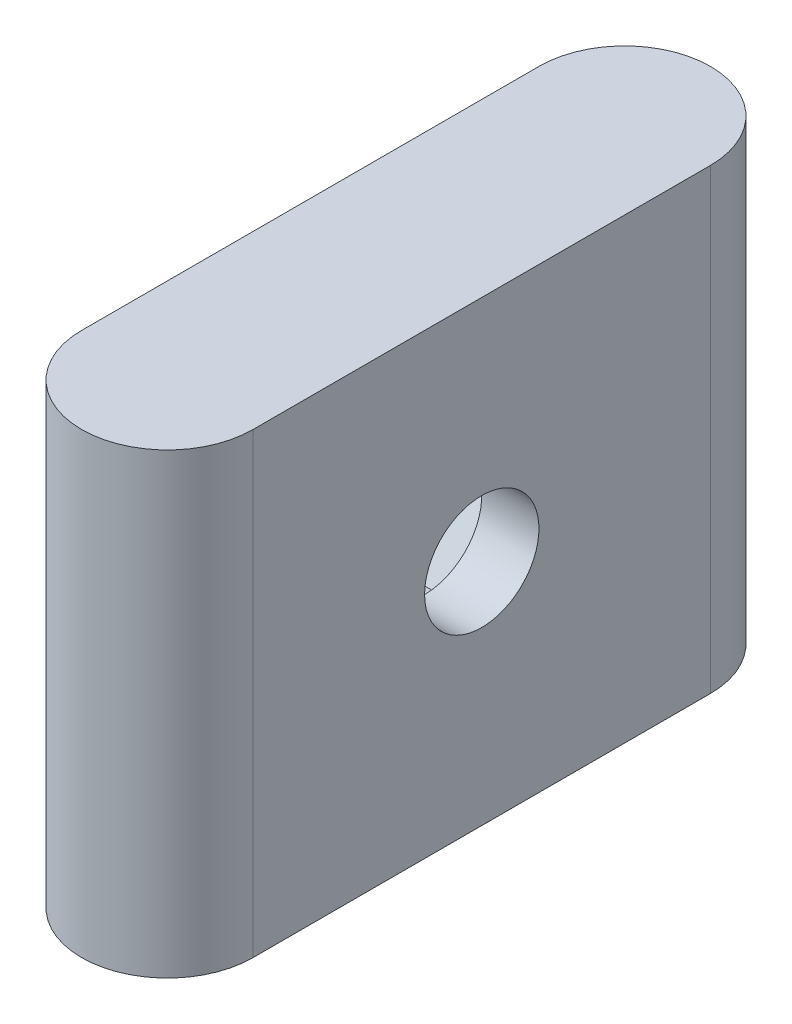
ISO-10303-21;
HEADER;
FILE_DESCRIPTION(('STEP AP214'),'2;1');
FILE_NAME('part.step','',(''),(''),'','','');
FILE_SCHEMA(('AUTOMOTIVE_DESIGN { 1 0 10303 214 1 1 1 1 }'));
ENDSEC;
DATA;
#1=APPLICATION_CONTEXT('core data for automotive mechanical design processes');
#2=APPLICATION_PROTOCOL_DEFINITION('international standard','automotive_design',2000,#1);
#3=PRODUCT_CONTEXT('',#1,'mechanical');
#4=PRODUCT('Part','Part','',(#3));
#5=PRODUCT_RELATED_PRODUCT_CATEGORY('part','',(#4));
#6=PRODUCT_DEFINITION_FORMATION('','',#4);
#7=PRODUCT_DEFINITION_CONTEXT('part definition',#1,'design');
#8=PRODUCT_DEFINITION('design','',#6,#7);
#9=PRODUCT_DEFINITION_SHAPE('','',#8);
#10=(LENGTH_UNIT() NAMED_UNIT(*) SI_UNIT(.MILLI.,.METRE.));
#11=(NAMED_UNIT(*) PLANE_ANGLE_UNIT() SI_UNIT($,.RADIAN.));
#12=(NAMED_UNIT(*) SI_UNIT($,.STERADIAN.) SOLID_ANGLE_UNIT());
#13=UNCERTAINTY_MEASURE_WITH_UNIT(LENGTH_MEASURE(1.E-05),#10,'distance_accuracy_value','');
#14=(GEOMETRIC_REPRESENTATION_CONTEXT(3) GLOBAL_UNCERTAINTY_ASSIGNED_CONTEXT((#13)) GLOBAL_UNIT_ASSIGNED_CONTEXT((#10,
#11,#12)) REPRESENTATION_CONTEXT('',''));
#15=CARTESIAN_POINT('',(0.,0.,0.));
#16=DIRECTION('',(0.,0.,1.));
#17=DIRECTION('',(1.,0.,0.));
#18=AXIS2_PLACEMENT_3D('',#15,#16,#17);
#19=CARTESIAN_POINT('',(16.25,10.,-1.54270387980563));
#20=DIRECTION('',(-1.,0.,0.));
#21=DIRECTION('',(0.,0.,1.));
#22=AXIS2_PLACEMENT_3D('',#19,#20,#21);
#23=CYLINDRICAL_SURFACE('',#22,2.5);
#24=CARTESIAN_POINT('',(3.75,10.,-1.54270387980563));
#25=DIRECTION('',(-1.,0.,0.));
#26=DIRECTION('',(0.,0.,1.));
#27=AXIS2_PLACEMENT_3D('',#24,#25,#26);
#28=CIRCLE('',#27,2.5);
#29=CARTESIAN_POINT('',(3.75,10.,0.957296120194369));
#30=VERTEX_POINT('',#29);
#31=EDGE_CURVE('E191',#30,#30,#28,.T.);
#32=ORIENTED_EDGE('',*,*,#31,.F.);
#33=EDGE_LOOP('',(#32));
#34=FACE_BOUND('',#33,.T.);
#35=CARTESIAN_POINT('',(1.25,10.,-1.54270387980563));
#36=DIRECTION('',(-1.,0.,0.));
#37=DIRECTION('',(0.,0.,1.));
#38=AXIS2_PLACEMENT_3D('',#35,#36,#37);
#39=CIRCLE('',#38,2.5);
#40=CARTESIAN_POINT('',(1.25,10.,0.957296120194369));
#41=VERTEX_POINT('',#40);
#42=EDGE_CURVE('E159',#41,#41,#39,.T.);
#43=ORIENTED_EDGE('',*,*,#42,.T.);
#44=EDGE_LOOP('',(#43));
#45=FACE_BOUND('',#44,.T.);
#46=ADVANCED_FACE('F41',(#34,#45),#23,.F.);
#47=CARTESIAN_POINT('',(0.,20.,8.45729612019437));
#48=DIRECTION('',(0.,-1.,0.));
#49=DIRECTION('',(0.,0.,-1.));
#50=AXIS2_PLACEMENT_3D('',#47,#48,#49);
#51=CYLINDRICAL_SURFACE('',#50,3.75);
#52=CARTESIAN_POINT('',(0.,0.,8.45729612019437));
#53=DIRECTION('',(0.,1.,0.));
#54=DIRECTION('',(0.,0.,1.));
#55=AXIS2_PLACEMENT_3D('',#52,#53,#54);
#56=CIRCLE('',#55,3.75);
#57=CARTESIAN_POINT('',(-3.75,0.,8.45729612019437));
#58=VERTEX_POINT('',#57);
#59=CARTESIAN_POINT('',(3.75,0.,8.45729612019437));
#60=VERTEX_POINT('',#59);
#61=EDGE_CURVE('E206',#58,#60,#56,.T.);
#62=ORIENTED_EDGE('',*,*,#61,.T.);
#63=DIRECTION('',(0.,-1.,0.));
#64=VECTOR('',#63,1.);
#65=CARTESIAN_POINT('',(3.75,20.,8.45729612019437));
#66=LINE('',#65,#64);
#67=CARTESIAN_POINT('',(3.75,20.,8.45729612019437));
#68=VERTEX_POINT('',#67);
#69=EDGE_CURVE('E11',#68,#60,#66,.T.);
#70=ORIENTED_EDGE('',*,*,#69,.F.);
#71=CARTESIAN_POINT('',(0.,20.,8.45729612019437));
#72=DIRECTION('',(0.,1.,0.));
#73=DIRECTION('',(0.,0.,1.));
#74=AXIS2_PLACEMENT_3D('',#71,#72,#73);
#75=CIRCLE('',#74,3.75);
#76=CARTESIAN_POINT('',(-3.75,20.,8.45729612019437));
#77=VERTEX_POINT('',#76);
#78=EDGE_CURVE('E207',#77,#68,#75,.T.);
#79=ORIENTED_EDGE('',*,*,#78,.F.);
#80=DIRECTION('',(0.,-1.,0.));
#81=VECTOR('',#80,1.);
#82=CARTESIAN_POINT('',(-3.75,20.,8.45729612019437));
#83=LINE('',#82,#81);
#84=EDGE_CURVE('E217',#77,#58,#83,.T.);
#85=ORIENTED_EDGE('',*,*,#84,.T.);
#86=EDGE_LOOP('',(#62,#70,#79,#85));
#87=FACE_BOUND('',#86,.T.);
#88=ADVANCED_FACE('F43',(#87),#51,.T.);
#89=CARTESIAN_POINT('',(3.75,20.,8.45729612019437));
#90=DIRECTION('',(-1.,0.,0.));
#91=DIRECTION('',(0.,0.,1.));
#92=AXIS2_PLACEMENT_3D('',#89,#90,#91);
#93=PLANE('',#92);
#94=ORIENTED_EDGE('',*,*,#31,.T.);
#95=EDGE_LOOP('',(#94));
#96=FACE_BOUND('',#95,.T.);
#97=DIRECTION('',(0.,0.,-1.));
#98=VECTOR('',#97,1.);
#99=CARTESIAN_POINT('',(3.75,0.,8.45729612019437));
#100=LINE('',#99,#98);
#101=CARTESIAN_POINT('',(3.75,0.,-11.5427038798056));
#102=VERTEX_POINT('',#101);
#103=EDGE_CURVE('E221',#60,#102,#100,.T.);
#104=ORIENTED_EDGE('',*,*,#103,.T.);
#105=DIRECTION('',(0.,-1.,0.));
#106=VECTOR('',#105,1.);
#107=CARTESIAN_POINT('',(3.75,20.,-11.5427038798056));
#108=LINE('',#107,#106);
#109=CARTESIAN_POINT('',(3.75,20.,-11.5427038798056));
#110=VERTEX_POINT('',#109);
#111=EDGE_CURVE('E50',#110,#102,#108,.T.);
#112=ORIENTED_EDGE('',*,*,#111,.F.);
#113=DIRECTION('',(0.,0.,-1.));
#114=VECTOR('',#113,1.);
#115=CARTESIAN_POINT('',(3.75,20.,8.45729612019437));
#116=LINE('',#115,#114);
#117=EDGE_CURVE('E94',#68,#110,#116,.T.);
#118=ORIENTED_EDGE('',*,*,#117,.F.);
#119=ORIENTED_EDGE('',*,*,#69,.T.);
#120=EDGE_LOOP('',(#104,#112,#118,#119));
#121=FACE_BOUND('',#120,.T.);
#122=ADVANCED_FACE('F256',(#96,#121),#93,.F.);
#123=CARTESIAN_POINT('',(0.,20.,-11.5427038798056));
#124=DIRECTION('',(0.,-1.,0.));
#125=DIRECTION('',(0.,0.,-1.));
#126=AXIS2_PLACEMENT_3D('',#123,#124,#125);
#127=CYLINDRICAL_SURFACE('',#126,3.75);
#128=CARTESIAN_POINT('',(0.,0.,-11.5427038798056));
#129=DIRECTION('',(0.,1.,0.));
#130=DIRECTION('',(0.,0.,1.));
#131=AXIS2_PLACEMENT_3D('',#128,#129,#130);
#132=CIRCLE('',#131,3.75);
#133=CARTESIAN_POINT('',(-3.75,0.,-11.5427038798056));
#134=VERTEX_POINT('',#133);
#135=EDGE_CURVE('E224',#102,#134,#132,.T.);
#136=ORIENTED_EDGE('',*,*,#135,.T.);
#137=DIRECTION('',(0.,-1.,0.));
#138=VECTOR('',#137,1.);
#139=CARTESIAN_POINT('',(-3.75,20.,-11.5427038798056));
#140=LINE('',#139,#138);
#141=CARTESIAN_POINT('',(-3.75,20.,-11.5427038798056));
#142=VERTEX_POINT('',#141);
#143=EDGE_CURVE('E231',#142,#134,#140,.T.);
#144=ORIENTED_EDGE('',*,*,#143,.F.);
#145=CARTESIAN_POINT('',(0.,20.,-11.5427038798056));
#146=DIRECTION('',(0.,1.,0.));
#147=DIRECTION('',(0.,0.,1.));
#148=AXIS2_PLACEMENT_3D('',#145,#146,#147);
#149=CIRCLE('',#148,3.75);
#150=EDGE_CURVE('E212',#110,#142,#149,.T.);
#151=ORIENTED_EDGE('',*,*,#150,.F.);
#152=ORIENTED_EDGE('',*,*,#111,.T.);
#153=EDGE_LOOP('',(#136,#144,#151,#152));
#154=FACE_BOUND('',#153,.T.);
#155=ADVANCED_FACE('F238',(#154),#127,.T.);
#156=CARTESIAN_POINT('',(-3.75,20.,8.45729612019437));
#157=DIRECTION('',(1.,0.,0.));
#158=DIRECTION('',(0.,0.,-1.));
#159=AXIS2_PLACEMENT_3D('',#156,#157,#158);
#160=PLANE('',#159);
#161=DIRECTION('',(0.,0.866025403784439,-0.5));
#162=VECTOR('',#161,1.);
#163=CARTESIAN_POINT('',(-3.75,10.,4.40209548739866));
#164=LINE('',#163,#162);
#165=CARTESIAN_POINT('',(-3.75,10.,4.40209548739866));
#166=VERTEX_POINT('',#165);
#167=CARTESIAN_POINT('',(-3.75,15.1483472724006,1.42969580379652));
#168=VERTEX_POINT('',#167);
#169=EDGE_CURVE('E174',#166,#168,#164,.T.);
#170=ORIENTED_EDGE('',*,*,#169,.F.);
#171=DIRECTION('',(0.,0.866025403784439,0.5));
#172=VECTOR('',#171,1.);
#173=CARTESIAN_POINT('',(-3.75,4.85165272759942,1.42969580379652));
#174=LINE('',#173,#172);
#175=CARTESIAN_POINT('',(-3.75,4.85165272759942,1.42969580379652));
#176=VERTEX_POINT('',#175);
#177=EDGE_CURVE('E57',#176,#166,#174,.T.);
#178=ORIENTED_EDGE('',*,*,#177,.F.);
#179=DIRECTION('',(0.,0.,1.));
#180=VECTOR('',#179,1.);
#181=CARTESIAN_POINT('',(-3.75,4.85165272759942,-4.51510356340778));
#182=LINE('',#181,#180);
#183=CARTESIAN_POINT('',(-3.75,4.85165272759942,-4.51510356340778));
#184=VERTEX_POINT('',#183);
#185=EDGE_CURVE('E152',#184,#176,#182,.T.);
#186=ORIENTED_EDGE('',*,*,#185,.F.);
#187=DIRECTION('',(0.,-0.866025403784438,0.5));
#188=VECTOR('',#187,1.);
#189=CARTESIAN_POINT('',(-3.75,9.99999999999999,-7.48750324700993));
#190=LINE('',#189,#188);
#191=CARTESIAN_POINT('',(-3.75,9.99999999999999,-7.48750324700993));
#192=VERTEX_POINT('',#191);
#193=EDGE_CURVE('E156',#192,#184,#190,.T.);
#194=ORIENTED_EDGE('',*,*,#193,.F.);
#195=DIRECTION('',(0.,-0.866025403784439,-0.5));
#196=VECTOR('',#195,1.);
#197=CARTESIAN_POINT('',(-3.75,15.1483472724006,-4.51510356340778));
#198=LINE('',#197,#196);
#199=CARTESIAN_POINT('',(-3.75,15.1483472724006,-4.51510356340778));
#200=VERTEX_POINT('',#199);
#201=EDGE_CURVE('E181',#200,#192,#198,.T.);
#202=ORIENTED_EDGE('',*,*,#201,.F.);
#203=DIRECTION('',(0.,0.,-1.));
#204=VECTOR('',#203,1.);
#205=CARTESIAN_POINT('',(-3.75,15.1483472724006,1.42969580379652));
#206=LINE('',#205,#204);
#207=EDGE_CURVE('E177',#168,#200,#206,.T.);
#208=ORIENTED_EDGE('',*,*,#207,.F.);
#209=EDGE_LOOP('',(#170,#178,#186,#194,#202,#208));
#210=FACE_BOUND('',#209,.T.);
#211=DIRECTION('',(0.,0.,1.));
#212=VECTOR('',#211,1.);
#213=CARTESIAN_POINT('',(-3.75,0.,8.45729612019437));
#214=LINE('',#213,#212);
#215=EDGE_CURVE('E87',#134,#58,#214,.T.);
#216=ORIENTED_EDGE('',*,*,#215,.T.);
#217=ORIENTED_EDGE('',*,*,#84,.F.);
#218=DIRECTION('',(0.,0.,1.));
#219=VECTOR('',#218,1.);
#220=CARTESIAN_POINT('',(-3.75,20.,8.45729612019437));
#221=LINE('',#220,#219);
#222=EDGE_CURVE('E66',#142,#77,#221,.T.);
#223=ORIENTED_EDGE('',*,*,#222,.F.);
#224=ORIENTED_EDGE('',*,*,#143,.T.);
#225=EDGE_LOOP('',(#216,#217,#223,#224));
#226=FACE_BOUND('',#225,.T.);
#227=ADVANCED_FACE('F246',(#210,#226),#160,.F.);
#228=CARTESIAN_POINT('',(0.,20.,8.45729612019437));
#229=DIRECTION('',(0.,1.,0.));
#230=DIRECTION('',(0.,0.,1.));
#231=AXIS2_PLACEMENT_3D('',#228,#229,#230);
#232=PLANE('',#231);
#233=ORIENTED_EDGE('',*,*,#78,.T.);
#234=ORIENTED_EDGE('',*,*,#117,.T.);
#235=ORIENTED_EDGE('',*,*,#150,.T.);
#236=ORIENTED_EDGE('',*,*,#222,.T.);
#237=EDGE_LOOP('',(#233,#234,#235,#236));
#238=FACE_BOUND('',#237,.T.);
#239=ADVANCED_FACE('F248',(#238),#232,.T.);
#240=CARTESIAN_POINT('',(0.,0.,8.45729612019437));
#241=DIRECTION('',(0.,1.,0.));
#242=DIRECTION('',(0.,0.,1.));
#243=AXIS2_PLACEMENT_3D('',#240,#241,#242);
#244=PLANE('',#243);
#245=ORIENTED_EDGE('',*,*,#61,.F.);
#246=ORIENTED_EDGE('',*,*,#215,.F.);
#247=ORIENTED_EDGE('',*,*,#135,.F.);
#248=ORIENTED_EDGE('',*,*,#103,.F.);
#249=EDGE_LOOP('',(#245,#246,#247,#248));
#250=FACE_BOUND('',#249,.T.);
#251=ADVANCED_FACE('F242',(#250),#244,.F.);
#252=CARTESIAN_POINT('',(1.25,4.85165272759942,1.42969580379652));
#253=DIRECTION('',(0.,-0.5,0.866025403784439));
#254=DIRECTION('',(0.,-0.866025403784439,-0.5));
#255=AXIS2_PLACEMENT_3D('',#252,#253,#254);
#256=PLANE('',#255);
#257=ORIENTED_EDGE('',*,*,#177,.T.);
#258=DIRECTION('',(-1.,0.,0.));
#259=VECTOR('',#258,1.);
#260=CARTESIAN_POINT('',(1.25,10.,4.40209548739866));
#261=LINE('',#260,#259);
#262=CARTESIAN_POINT('',(1.25,10.,4.40209548739866));
#263=VERTEX_POINT('',#262);
#264=EDGE_CURVE('E126',#263,#166,#261,.T.);
#265=ORIENTED_EDGE('',*,*,#264,.F.);
#266=DIRECTION('',(0.,0.866025403784439,0.5));
#267=VECTOR('',#266,1.);
#268=CARTESIAN_POINT('',(1.25,4.85165272759942,1.42969580379652));
#269=LINE('',#268,#267);
#270=CARTESIAN_POINT('',(1.25,4.85165272759942,1.42969580379652));
#271=VERTEX_POINT('',#270);
#272=EDGE_CURVE('E130',#271,#263,#269,.T.);
#273=ORIENTED_EDGE('',*,*,#272,.F.);
#274=DIRECTION('',(-1.,0.,0.));
#275=VECTOR('',#274,1.);
#276=CARTESIAN_POINT('',(1.25,4.85165272759942,1.42969580379652));
#277=LINE('',#276,#275);
#278=EDGE_CURVE('E188',#271,#176,#277,.T.);
#279=ORIENTED_EDGE('',*,*,#278,.T.);
#280=EDGE_LOOP('',(#257,#265,#273,#279));
#281=FACE_BOUND('',#280,.T.);
#282=ADVANCED_FACE('F128',(#281),#256,.F.);
#283=CARTESIAN_POINT('',(1.25,4.85165272759942,-4.51510356340778));
#284=DIRECTION('',(0.,-1.,0.));
#285=DIRECTION('',(0.,0.,-1.));
#286=AXIS2_PLACEMENT_3D('',#283,#284,#285);
#287=PLANE('',#286);
#288=ORIENTED_EDGE('',*,*,#185,.T.);
#289=ORIENTED_EDGE('',*,*,#278,.F.);
#290=DIRECTION('',(0.,0.,1.));
#291=VECTOR('',#290,1.);
#292=CARTESIAN_POINT('',(1.25,4.85165272759942,-4.51510356340778));
#293=LINE('',#292,#291);
#294=CARTESIAN_POINT('',(1.25,4.85165272759942,-4.51510356340778));
#295=VERTEX_POINT('',#294);
#296=EDGE_CURVE('E137',#295,#271,#293,.T.);
#297=ORIENTED_EDGE('',*,*,#296,.F.);
#298=DIRECTION('',(-1.,0.,0.));
#299=VECTOR('',#298,1.);
#300=CARTESIAN_POINT('',(1.25,4.85165272759942,-4.51510356340778));
#301=LINE('',#300,#299);
#302=EDGE_CURVE('E192',#295,#184,#301,.T.);
#303=ORIENTED_EDGE('',*,*,#302,.T.);
#304=EDGE_LOOP('',(#288,#289,#297,#303));
#305=FACE_BOUND('',#304,.T.);
#306=ADVANCED_FACE('F273',(#305),#287,.F.);
#307=CARTESIAN_POINT('',(1.25,9.99999999999999,-7.48750324700993));
#308=DIRECTION('',(0.,-0.5,-0.866025403784438));
#309=DIRECTION('',(0.,0.866025403784438,-0.5));
#310=AXIS2_PLACEMENT_3D('',#307,#308,#309);
#311=PLANE('',#310);
#312=ORIENTED_EDGE('',*,*,#193,.T.);
#313=ORIENTED_EDGE('',*,*,#302,.F.);
#314=DIRECTION('',(0.,-0.866025403784438,0.5));
#315=VECTOR('',#314,1.);
#316=CARTESIAN_POINT('',(1.25,9.99999999999999,-7.48750324700993));
#317=LINE('',#316,#315);
#318=CARTESIAN_POINT('',(1.25,9.99999999999999,-7.48750324700993));
#319=VERTEX_POINT('',#318);
#320=EDGE_CURVE('E167',#319,#295,#317,.T.);
#321=ORIENTED_EDGE('',*,*,#320,.F.);
#322=DIRECTION('',(-1.,0.,0.));
#323=VECTOR('',#322,1.);
#324=CARTESIAN_POINT('',(1.25,9.99999999999999,-7.48750324700993));
#325=LINE('',#324,#323);
#326=EDGE_CURVE('E195',#319,#192,#325,.T.);
#327=ORIENTED_EDGE('',*,*,#326,.T.);
#328=EDGE_LOOP('',(#312,#313,#321,#327));
#329=FACE_BOUND('',#328,.T.);
#330=ADVANCED_FACE('F277',(#329),#311,.F.);
#331=CARTESIAN_POINT('',(1.25,15.1483472724006,-4.51510356340778));
#332=DIRECTION('',(0.,0.5,-0.866025403784439));
#333=DIRECTION('',(0.,0.866025403784439,0.5));
#334=AXIS2_PLACEMENT_3D('',#331,#332,#333);
#335=PLANE('',#334);
#336=ORIENTED_EDGE('',*,*,#201,.T.);
#337=ORIENTED_EDGE('',*,*,#326,.F.);
#338=DIRECTION('',(0.,-0.866025403784439,-0.5));
#339=VECTOR('',#338,1.);
#340=CARTESIAN_POINT('',(1.25,15.1483472724006,-4.51510356340778));
#341=LINE('',#340,#339);
#342=CARTESIAN_POINT('',(1.25,15.1483472724006,-4.51510356340778));
#343=VERTEX_POINT('',#342);
#344=EDGE_CURVE('E163',#343,#319,#341,.T.);
#345=ORIENTED_EDGE('',*,*,#344,.F.);
#346=DIRECTION('',(-1.,0.,0.));
#347=VECTOR('',#346,1.);
#348=CARTESIAN_POINT('',(1.25,15.1483472724006,-4.51510356340778));
#349=LINE('',#348,#347);
#350=EDGE_CURVE('E198',#343,#200,#349,.T.);
#351=ORIENTED_EDGE('',*,*,#350,.T.);
#352=EDGE_LOOP('',(#336,#337,#345,#351));
#353=FACE_BOUND('',#352,.T.);
#354=ADVANCED_FACE('F283',(#353),#335,.F.);
#355=CARTESIAN_POINT('',(1.25,15.1483472724006,1.42969580379652));
#356=DIRECTION('',(0.,1.,0.));
#357=DIRECTION('',(0.,0.,1.));
#358=AXIS2_PLACEMENT_3D('',#355,#356,#357);
#359=PLANE('',#358);
#360=ORIENTED_EDGE('',*,*,#207,.T.);
#361=ORIENTED_EDGE('',*,*,#350,.F.);
#362=DIRECTION('',(0.,0.,-1.));
#363=VECTOR('',#362,1.);
#364=CARTESIAN_POINT('',(1.25,15.1483472724006,1.42969580379652));
#365=LINE('',#364,#363);
#366=CARTESIAN_POINT('',(1.25,15.1483472724006,1.42969580379652));
#367=VERTEX_POINT('',#366);
#368=EDGE_CURVE('E146',#367,#343,#365,.T.);
#369=ORIENTED_EDGE('',*,*,#368,.F.);
#370=DIRECTION('',(-1.,0.,0.));
#371=VECTOR('',#370,1.);
#372=CARTESIAN_POINT('',(1.25,15.1483472724006,1.42969580379652));
#373=LINE('',#372,#371);
#374=EDGE_CURVE('E136',#367,#168,#373,.T.);
#375=ORIENTED_EDGE('',*,*,#374,.T.);
#376=EDGE_LOOP('',(#360,#361,#369,#375));
#377=FACE_BOUND('',#376,.T.);
#378=ADVANCED_FACE('F290',(#377),#359,.F.);
#379=CARTESIAN_POINT('',(1.25,10.,4.40209548739866));
#380=DIRECTION('',(0.,0.5,0.866025403784439));
#381=DIRECTION('',(0.,-0.866025403784439,0.5));
#382=AXIS2_PLACEMENT_3D('',#379,#380,#381);
#383=PLANE('',#382);
#384=ORIENTED_EDGE('',*,*,#169,.T.);
#385=ORIENTED_EDGE('',*,*,#374,.F.);
#386=DIRECTION('',(0.,0.866025403784439,-0.5));
#387=VECTOR('',#386,1.);
#388=CARTESIAN_POINT('',(1.25,10.,4.40209548739866));
#389=LINE('',#388,#387);
#390=EDGE_CURVE('E140',#263,#367,#389,.T.);
#391=ORIENTED_EDGE('',*,*,#390,.F.);
#392=ORIENTED_EDGE('',*,*,#264,.T.);
#393=EDGE_LOOP('',(#384,#385,#391,#392));
#394=FACE_BOUND('',#393,.T.);
#395=ADVANCED_FACE('F141',(#394),#383,.F.);
#396=CARTESIAN_POINT('',(1.25,0.,0.));
#397=DIRECTION('',(-1.,0.,0.));
#398=DIRECTION('',(0.,0.,1.));
#399=AXIS2_PLACEMENT_3D('',#396,#397,#398);
#400=PLANE('',#399);
#401=ORIENTED_EDGE('',*,*,#42,.F.);
#402=EDGE_LOOP('',(#401));
#403=FACE_BOUND('',#402,.T.);
#404=ORIENTED_EDGE('',*,*,#272,.T.);
#405=ORIENTED_EDGE('',*,*,#390,.T.);
#406=ORIENTED_EDGE('',*,*,#368,.T.);
#407=ORIENTED_EDGE('',*,*,#344,.T.);
#408=ORIENTED_EDGE('',*,*,#320,.T.);
#409=ORIENTED_EDGE('',*,*,#296,.T.);
#410=EDGE_LOOP('',(#404,#405,#406,#407,#408,#409));
#411=FACE_BOUND('',#410,.T.);
#412=ADVANCED_FACE('F148',(#403,#411),#400,.T.);
#413=CLOSED_SHELL('',(#46,#88,#122,#155,#227,#239,#251,#282,#306,#330,#354,#378,#395,#412));
#414=MANIFOLD_SOLID_BREP('B2',#413);
#415=ADVANCED_BREP_SHAPE_REPRESENTATION('',(#18,#414),#14);
#416=SHAPE_DEFINITION_REPRESENTATION(#9,#415);
ENDSEC;
END-ISO-10303-21;
